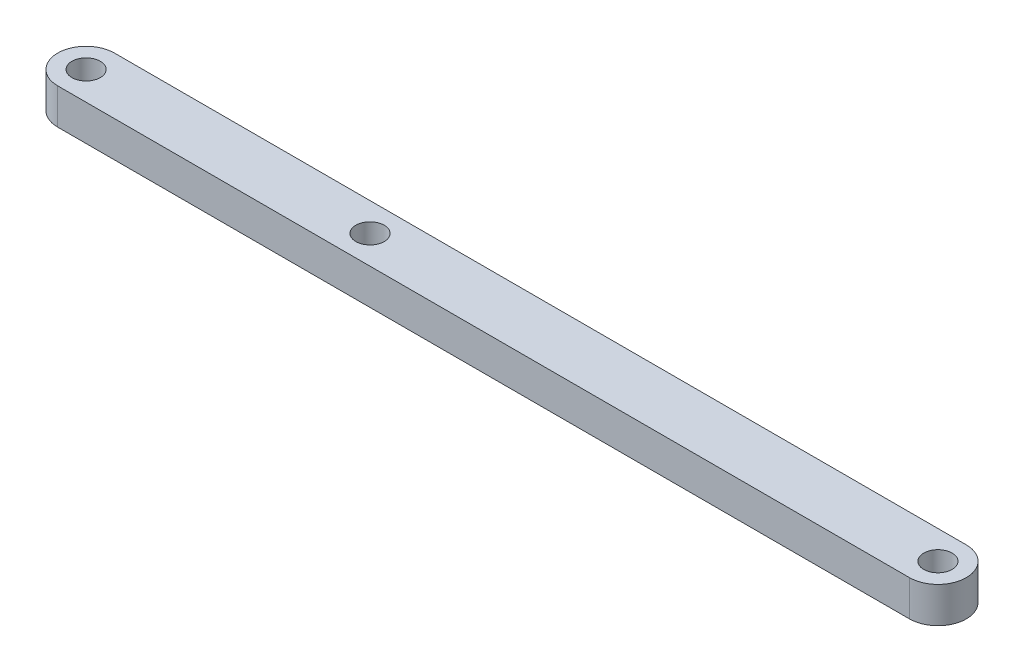
ISO-10303-21;
HEADER;
FILE_DESCRIPTION(('STEP AP214'),'2;1');
FILE_NAME('part.step','',(''),(''),'','','');
FILE_SCHEMA(('AUTOMOTIVE_DESIGN { 1 0 10303 214 1 1 1 1 }'));
ENDSEC;
DATA;
#1=APPLICATION_CONTEXT('core data for automotive mechanical design processes');
#2=APPLICATION_PROTOCOL_DEFINITION('international standard','automotive_design',2000,#1);
#3=PRODUCT_CONTEXT('',#1,'mechanical');
#4=PRODUCT('Part','Part','',(#3));
#5=PRODUCT_RELATED_PRODUCT_CATEGORY('part','',(#4));
#6=PRODUCT_DEFINITION_FORMATION('','',#4);
#7=PRODUCT_DEFINITION_CONTEXT('part definition',#1,'design');
#8=PRODUCT_DEFINITION('design','',#6,#7);
#9=PRODUCT_DEFINITION_SHAPE('','',#8);
#10=(LENGTH_UNIT() NAMED_UNIT(*) SI_UNIT(.MILLI.,.METRE.));
#11=(NAMED_UNIT(*) PLANE_ANGLE_UNIT() SI_UNIT($,.RADIAN.));
#12=(NAMED_UNIT(*) SI_UNIT($,.STERADIAN.) SOLID_ANGLE_UNIT());
#13=UNCERTAINTY_MEASURE_WITH_UNIT(LENGTH_MEASURE(1.E-05),#10,'distance_accuracy_value','');
#14=(GEOMETRIC_REPRESENTATION_CONTEXT(3) GLOBAL_UNCERTAINTY_ASSIGNED_CONTEXT((#13)) GLOBAL_UNIT_ASSIGNED_CONTEXT((#10,
#11,#12)) REPRESENTATION_CONTEXT('',''));
#15=CARTESIAN_POINT('',(0.,0.,0.));
#16=DIRECTION('',(0.,0.,1.));
#17=DIRECTION('',(1.,0.,0.));
#18=AXIS2_PLACEMENT_3D('',#15,#16,#17);
#19=CARTESIAN_POINT('',(-19.05,3.2004,0.));
#20=DIRECTION('',(0.,1.,0.));
#21=DIRECTION('',(0.,0.,1.));
#22=AXIS2_PLACEMENT_3D('',#19,#20,#21);
#23=PLANE('',#22);
#24=CARTESIAN_POINT('',(-19.05,3.2004,0.));
#25=DIRECTION('',(0.,1.,0.));
#26=DIRECTION('',(0.,0.,1.));
#27=AXIS2_PLACEMENT_3D('',#24,#25,#26);
#28=CIRCLE('',#27,1.26999999999999);
#29=CARTESIAN_POINT('',(-19.05,3.2004,1.26999999999999));
#30=VERTEX_POINT('',#29);
#31=EDGE_CURVE('E115',#30,#30,#28,.T.);
#32=ORIENTED_EDGE('',*,*,#31,.F.);
#33=EDGE_LOOP('',(#32));
#34=FACE_BOUND('',#33,.T.);
#35=CARTESIAN_POINT('',(-19.05,3.2004,0.));
#36=DIRECTION('',(0.,1.,0.));
#37=DIRECTION('',(0.,0.,1.));
#38=AXIS2_PLACEMENT_3D('',#35,#36,#37);
#39=CIRCLE('',#38,2.54);
#40=CARTESIAN_POINT('',(-19.05,3.2004,2.54));
#41=VERTEX_POINT('',#40);
#42=CARTESIAN_POINT('',(-19.05,3.2004,-2.54));
#43=VERTEX_POINT('',#42);
#44=EDGE_CURVE('E85',#41,#43,#39,.T.);
#45=ORIENTED_EDGE('',*,*,#44,.T.);
#46=DIRECTION('',(-1.,0.,0.));
#47=VECTOR('',#46,1.);
#48=CARTESIAN_POINT('',(-95.25,3.2004,-2.54));
#49=LINE('',#48,#47);
#50=CARTESIAN_POINT('',(-95.25,3.2004,-2.54));
#51=VERTEX_POINT('',#50);
#52=EDGE_CURVE('E80',#43,#51,#49,.T.);
#53=ORIENTED_EDGE('',*,*,#52,.T.);
#54=CARTESIAN_POINT('',(-95.25,3.2004,0.));
#55=DIRECTION('',(0.,1.,0.));
#56=DIRECTION('',(0.,0.,1.));
#57=AXIS2_PLACEMENT_3D('',#54,#55,#56);
#58=CIRCLE('',#57,2.54);
#59=CARTESIAN_POINT('',(-95.25,3.2004,2.54));
#60=VERTEX_POINT('',#59);
#61=EDGE_CURVE('E83',#51,#60,#58,.T.);
#62=ORIENTED_EDGE('',*,*,#61,.T.);
#63=DIRECTION('',(1.,0.,0.));
#64=VECTOR('',#63,1.);
#65=CARTESIAN_POINT('',(-95.25,3.2004,2.54));
#66=LINE('',#65,#64);
#67=EDGE_CURVE('E50',#60,#41,#66,.T.);
#68=ORIENTED_EDGE('',*,*,#67,.T.);
#69=EDGE_LOOP('',(#45,#53,#62,#68));
#70=FACE_BOUND('',#69,.T.);
#71=CARTESIAN_POINT('',(-95.25,3.2004,0.));
#72=DIRECTION('',(0.,1.,0.));
#73=DIRECTION('',(0.,0.,1.));
#74=AXIS2_PLACEMENT_3D('',#71,#72,#73);
#75=CIRCLE('',#74,1.26999999999999);
#76=CARTESIAN_POINT('',(-95.25,3.2004,1.26999999999999));
#77=VERTEX_POINT('',#76);
#78=EDGE_CURVE('E100',#77,#77,#75,.T.);
#79=ORIENTED_EDGE('',*,*,#78,.F.);
#80=EDGE_LOOP('',(#79));
#81=FACE_BOUND('',#80,.T.);
#82=CARTESIAN_POINT('',(-69.85,3.2004,0.));
#83=DIRECTION('',(0.,1.,0.));
#84=DIRECTION('',(0.,0.,1.));
#85=AXIS2_PLACEMENT_3D('',#82,#83,#84);
#86=CIRCLE('',#85,1.26999999999999);
#87=CARTESIAN_POINT('',(-69.85,3.2004,1.26999999999999));
#88=VERTEX_POINT('',#87);
#89=EDGE_CURVE('E121',#88,#88,#86,.T.);
#90=ORIENTED_EDGE('',*,*,#89,.F.);
#91=EDGE_LOOP('',(#90));
#92=FACE_BOUND('',#91,.T.);
#93=ADVANCED_FACE('F33',(#34,#70,#81,#92),#23,.T.);
#94=CARTESIAN_POINT('',(-19.05,0.,0.));
#95=DIRECTION('',(0.,1.,0.));
#96=DIRECTION('',(0.,0.,1.));
#97=AXIS2_PLACEMENT_3D('',#94,#95,#96);
#98=PLANE('',#97);
#99=CARTESIAN_POINT('',(-19.05,0.,0.));
#100=DIRECTION('',(0.,1.,0.));
#101=DIRECTION('',(0.,0.,1.));
#102=AXIS2_PLACEMENT_3D('',#99,#100,#101);
#103=CIRCLE('',#102,1.26999999999999);
#104=CARTESIAN_POINT('',(-19.05,0.,1.26999999999999));
#105=VERTEX_POINT('',#104);
#106=EDGE_CURVE('E118',#105,#105,#103,.T.);
#107=ORIENTED_EDGE('',*,*,#106,.T.);
#108=EDGE_LOOP('',(#107));
#109=FACE_BOUND('',#108,.T.);
#110=CARTESIAN_POINT('',(-19.05,0.,0.));
#111=DIRECTION('',(0.,1.,0.));
#112=DIRECTION('',(0.,0.,1.));
#113=AXIS2_PLACEMENT_3D('',#110,#111,#112);
#114=CIRCLE('',#113,2.54);
#115=CARTESIAN_POINT('',(-19.05,0.,2.54));
#116=VERTEX_POINT('',#115);
#117=CARTESIAN_POINT('',(-19.05,0.,-2.54));
#118=VERTEX_POINT('',#117);
#119=EDGE_CURVE('E97',#116,#118,#114,.T.);
#120=ORIENTED_EDGE('',*,*,#119,.F.);
#121=DIRECTION('',(1.,0.,0.));
#122=VECTOR('',#121,1.);
#123=CARTESIAN_POINT('',(-95.25,0.,2.54));
#124=LINE('',#123,#122);
#125=CARTESIAN_POINT('',(-95.25,0.,2.54));
#126=VERTEX_POINT('',#125);
#127=EDGE_CURVE('E73',#126,#116,#124,.T.);
#128=ORIENTED_EDGE('',*,*,#127,.F.);
#129=CARTESIAN_POINT('',(-95.25,0.,0.));
#130=DIRECTION('',(0.,1.,0.));
#131=DIRECTION('',(0.,0.,1.));
#132=AXIS2_PLACEMENT_3D('',#129,#130,#131);
#133=CIRCLE('',#132,2.54);
#134=CARTESIAN_POINT('',(-95.25,0.,-2.54));
#135=VERTEX_POINT('',#134);
#136=EDGE_CURVE('E67',#135,#126,#133,.T.);
#137=ORIENTED_EDGE('',*,*,#136,.F.);
#138=DIRECTION('',(-1.,0.,0.));
#139=VECTOR('',#138,1.);
#140=CARTESIAN_POINT('',(-95.25,0.,-2.54));
#141=LINE('',#140,#139);
#142=EDGE_CURVE('E89',#118,#135,#141,.T.);
#143=ORIENTED_EDGE('',*,*,#142,.F.);
#144=EDGE_LOOP('',(#120,#128,#137,#143));
#145=FACE_BOUND('',#144,.T.);
#146=CARTESIAN_POINT('',(-95.25,0.,0.));
#147=DIRECTION('',(0.,1.,0.));
#148=DIRECTION('',(0.,0.,1.));
#149=AXIS2_PLACEMENT_3D('',#146,#147,#148);
#150=CIRCLE('',#149,1.26999999999999);
#151=CARTESIAN_POINT('',(-95.25,0.,1.26999999999999));
#152=VERTEX_POINT('',#151);
#153=EDGE_CURVE('E112',#152,#152,#150,.T.);
#154=ORIENTED_EDGE('',*,*,#153,.T.);
#155=EDGE_LOOP('',(#154));
#156=FACE_BOUND('',#155,.T.);
#157=CARTESIAN_POINT('',(-69.85,0.,0.));
#158=DIRECTION('',(0.,1.,0.));
#159=DIRECTION('',(0.,0.,1.));
#160=AXIS2_PLACEMENT_3D('',#157,#158,#159);
#161=CIRCLE('',#160,1.26999999999999);
#162=CARTESIAN_POINT('',(-69.85,0.,1.26999999999999));
#163=VERTEX_POINT('',#162);
#164=EDGE_CURVE('E124',#163,#163,#161,.T.);
#165=ORIENTED_EDGE('',*,*,#164,.T.);
#166=EDGE_LOOP('',(#165));
#167=FACE_BOUND('',#166,.T.);
#168=ADVANCED_FACE('F108',(#109,#145,#156,#167),#98,.F.);
#169=CARTESIAN_POINT('',(-19.05,3.2004,0.));
#170=DIRECTION('',(0.,-1.,0.));
#171=DIRECTION('',(0.,0.,-1.));
#172=AXIS2_PLACEMENT_3D('',#169,#170,#171);
#173=CYLINDRICAL_SURFACE('',#172,2.54);
#174=ORIENTED_EDGE('',*,*,#119,.T.);
#175=DIRECTION('',(0.,-1.,0.));
#176=VECTOR('',#175,1.);
#177=CARTESIAN_POINT('',(-19.05,3.2004,-2.54));
#178=LINE('',#177,#176);
#179=EDGE_CURVE('E11',#43,#118,#178,.T.);
#180=ORIENTED_EDGE('',*,*,#179,.F.);
#181=ORIENTED_EDGE('',*,*,#44,.F.);
#182=DIRECTION('',(0.,-1.,0.));
#183=VECTOR('',#182,1.);
#184=CARTESIAN_POINT('',(-19.05,3.2004,2.54));
#185=LINE('',#184,#183);
#186=EDGE_CURVE('E93',#41,#116,#185,.T.);
#187=ORIENTED_EDGE('',*,*,#186,.T.);
#188=EDGE_LOOP('',(#174,#180,#181,#187));
#189=FACE_BOUND('',#188,.T.);
#190=ADVANCED_FACE('F35',(#189),#173,.T.);
#191=CARTESIAN_POINT('',(-95.25,3.2004,-2.54));
#192=DIRECTION('',(0.,0.,1.));
#193=DIRECTION('',(1.,0.,0.));
#194=AXIS2_PLACEMENT_3D('',#191,#192,#193);
#195=PLANE('',#194);
#196=ORIENTED_EDGE('',*,*,#142,.T.);
#197=DIRECTION('',(0.,-1.,0.));
#198=VECTOR('',#197,1.);
#199=CARTESIAN_POINT('',(-95.25,3.2004,-2.54));
#200=LINE('',#199,#198);
#201=EDGE_CURVE('E42',#51,#135,#200,.T.);
#202=ORIENTED_EDGE('',*,*,#201,.F.);
#203=ORIENTED_EDGE('',*,*,#52,.F.);
#204=ORIENTED_EDGE('',*,*,#179,.T.);
#205=EDGE_LOOP('',(#196,#202,#203,#204));
#206=FACE_BOUND('',#205,.T.);
#207=ADVANCED_FACE('F88',(#206),#195,.F.);
#208=CARTESIAN_POINT('',(-95.25,3.2004,0.));
#209=DIRECTION('',(0.,-1.,0.));
#210=DIRECTION('',(0.,0.,-1.));
#211=AXIS2_PLACEMENT_3D('',#208,#209,#210);
#212=CYLINDRICAL_SURFACE('',#211,2.54);
#213=ORIENTED_EDGE('',*,*,#136,.T.);
#214=DIRECTION('',(0.,-1.,0.));
#215=VECTOR('',#214,1.);
#216=CARTESIAN_POINT('',(-95.25,3.2004,2.54));
#217=LINE('',#216,#215);
#218=EDGE_CURVE('E90',#60,#126,#217,.T.);
#219=ORIENTED_EDGE('',*,*,#218,.F.);
#220=ORIENTED_EDGE('',*,*,#61,.F.);
#221=ORIENTED_EDGE('',*,*,#201,.T.);
#222=EDGE_LOOP('',(#213,#219,#220,#221));
#223=FACE_BOUND('',#222,.T.);
#224=ADVANCED_FACE('F91',(#223),#212,.T.);
#225=CARTESIAN_POINT('',(-95.25,3.2004,2.54));
#226=DIRECTION('',(0.,0.,-1.));
#227=DIRECTION('',(-1.,0.,0.));
#228=AXIS2_PLACEMENT_3D('',#225,#226,#227);
#229=PLANE('',#228);
#230=ORIENTED_EDGE('',*,*,#127,.T.);
#231=ORIENTED_EDGE('',*,*,#186,.F.);
#232=ORIENTED_EDGE('',*,*,#67,.F.);
#233=ORIENTED_EDGE('',*,*,#218,.T.);
#234=EDGE_LOOP('',(#230,#231,#232,#233));
#235=FACE_BOUND('',#234,.T.);
#236=ADVANCED_FACE('F105',(#235),#229,.F.);
#237=CARTESIAN_POINT('',(-95.25,3.2004,0.));
#238=DIRECTION('',(0.,-1.,0.));
#239=DIRECTION('',(0.,0.,-1.));
#240=AXIS2_PLACEMENT_3D('',#237,#238,#239);
#241=CYLINDRICAL_SURFACE('',#240,1.26999999999999);
#242=ORIENTED_EDGE('',*,*,#78,.T.);
#243=EDGE_LOOP('',(#242));
#244=FACE_BOUND('',#243,.T.);
#245=ORIENTED_EDGE('',*,*,#153,.F.);
#246=EDGE_LOOP('',(#245));
#247=FACE_BOUND('',#246,.T.);
#248=ADVANCED_FACE('F143',(#244,#247),#241,.F.);
#249=CARTESIAN_POINT('',(-19.05,3.2004,0.));
#250=DIRECTION('',(0.,-1.,0.));
#251=DIRECTION('',(0.,0.,-1.));
#252=AXIS2_PLACEMENT_3D('',#249,#250,#251);
#253=CYLINDRICAL_SURFACE('',#252,1.26999999999999);
#254=ORIENTED_EDGE('',*,*,#31,.T.);
#255=EDGE_LOOP('',(#254));
#256=FACE_BOUND('',#255,.T.);
#257=ORIENTED_EDGE('',*,*,#106,.F.);
#258=EDGE_LOOP('',(#257));
#259=FACE_BOUND('',#258,.T.);
#260=ADVANCED_FACE('F189',(#256,#259),#253,.F.);
#261=CARTESIAN_POINT('',(-69.85,3.2004,0.));
#262=DIRECTION('',(0.,-1.,0.));
#263=DIRECTION('',(0.,0.,-1.));
#264=AXIS2_PLACEMENT_3D('',#261,#262,#263);
#265=CYLINDRICAL_SURFACE('',#264,1.26999999999999);
#266=ORIENTED_EDGE('',*,*,#89,.T.);
#267=EDGE_LOOP('',(#266));
#268=FACE_BOUND('',#267,.T.);
#269=ORIENTED_EDGE('',*,*,#164,.F.);
#270=EDGE_LOOP('',(#269));
#271=FACE_BOUND('',#270,.T.);
#272=ADVANCED_FACE('F130',(#268,#271),#265,.F.);
#273=CLOSED_SHELL('',(#93,#168,#190,#207,#224,#236,#248,#260,#272));
#274=MANIFOLD_SOLID_BREP('B2',#273);
#275=ADVANCED_BREP_SHAPE_REPRESENTATION('',(#18,#274),#14);
#276=SHAPE_DEFINITION_REPRESENTATION(#9,#275);
ENDSEC;
END-ISO-10303-21;
